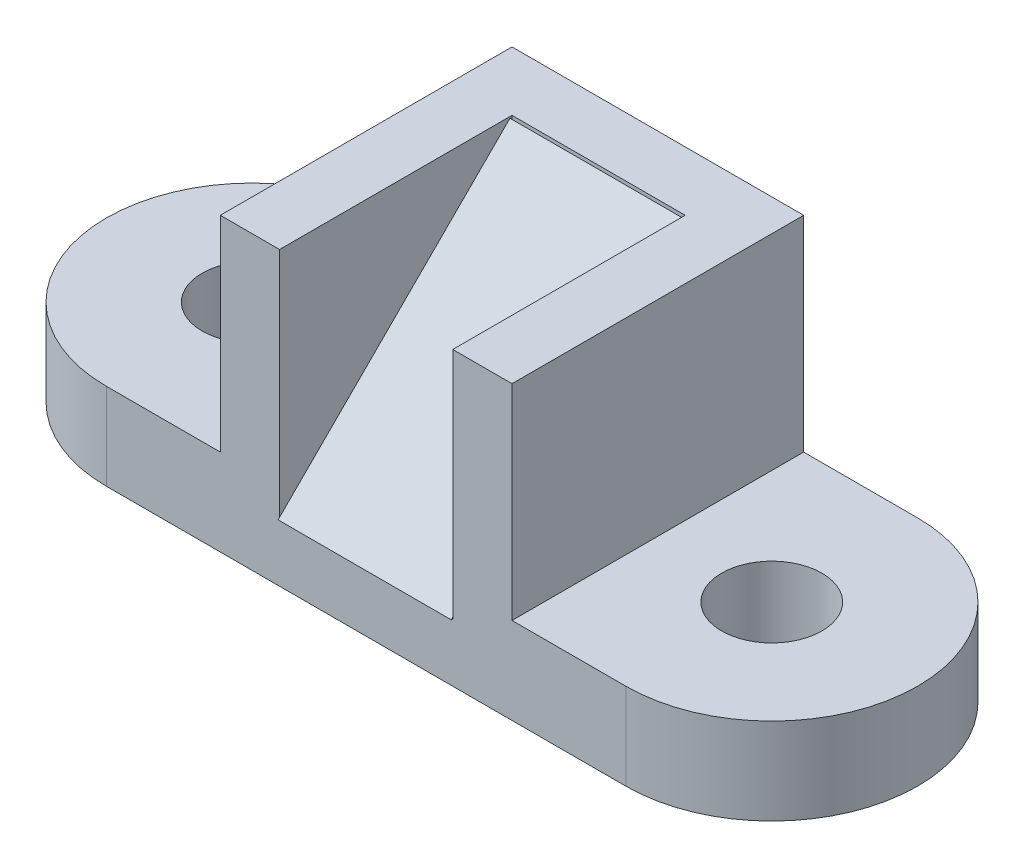
ISO-10303-21;
HEADER;
FILE_DESCRIPTION(('STEP AP214'),'2;1');
FILE_NAME('part.step','',(''),(''),'','','');
FILE_SCHEMA(('AUTOMOTIVE_DESIGN { 1 0 10303 214 1 1 1 1 }'));
ENDSEC;
DATA;
#1=APPLICATION_CONTEXT('core data for automotive mechanical design processes');
#2=APPLICATION_PROTOCOL_DEFINITION('international standard','automotive_design',2000,#1);
#3=PRODUCT_CONTEXT('',#1,'mechanical');
#4=PRODUCT('Part','Part','',(#3));
#5=PRODUCT_RELATED_PRODUCT_CATEGORY('part','',(#4));
#6=PRODUCT_DEFINITION_FORMATION('','',#4);
#7=PRODUCT_DEFINITION_CONTEXT('part definition',#1,'design');
#8=PRODUCT_DEFINITION('design','',#6,#7);
#9=PRODUCT_DEFINITION_SHAPE('','',#8);
#10=(LENGTH_UNIT() NAMED_UNIT(*) SI_UNIT(.MILLI.,.METRE.));
#11=(NAMED_UNIT(*) PLANE_ANGLE_UNIT() SI_UNIT($,.RADIAN.));
#12=(NAMED_UNIT(*) SI_UNIT($,.STERADIAN.) SOLID_ANGLE_UNIT());
#13=UNCERTAINTY_MEASURE_WITH_UNIT(LENGTH_MEASURE(1.E-05),#10,'distance_accuracy_value','');
#14=(GEOMETRIC_REPRESENTATION_CONTEXT(3) GLOBAL_UNCERTAINTY_ASSIGNED_CONTEXT((#13)) GLOBAL_UNIT_ASSIGNED_CONTEXT((#10,
#11,#12)) REPRESENTATION_CONTEXT('',''));
#15=CARTESIAN_POINT('',(0.,0.,0.));
#16=DIRECTION('',(0.,0.,1.));
#17=DIRECTION('',(1.,0.,0.));
#18=AXIS2_PLACEMENT_3D('',#15,#16,#17);
#19=CARTESIAN_POINT('',(0.,19.,32.));
#20=DIRECTION('',(0.,0.,-1.));
#21=DIRECTION('',(-1.,0.,0.));
#22=AXIS2_PLACEMENT_3D('',#19,#20,#21);
#23=PLANE('',#22);
#24=DIRECTION('',(0.,1.,0.));
#25=VECTOR('',#24,1.);
#26=CARTESIAN_POINT('',(76.,64.,32.));
#27=LINE('',#26,#25);
#28=CARTESIAN_POINT('',(76.,12.8068312342512,32.));
#29=VERTEX_POINT('',#28);
#30=CARTESIAN_POINT('',(76.,13.1171786874003,32.));
#31=VERTEX_POINT('',#30);
#32=EDGE_CURVE('E54',#29,#31,#27,.T.);
#33=ORIENTED_EDGE('',*,*,#32,.F.);
#34=DIRECTION('',(1.,0.,0.));
#35=VECTOR('',#34,1.);
#36=CARTESIAN_POINT('',(0.,12.8068312342512,32.));
#37=LINE('',#36,#35);
#38=CARTESIAN_POINT('',(38.,12.8068312342512,32.));
#39=VERTEX_POINT('',#38);
#40=EDGE_CURVE('E58',#39,#29,#37,.T.);
#41=ORIENTED_EDGE('',*,*,#40,.F.);
#42=DIRECTION('',(0.,1.,0.));
#43=VECTOR('',#42,1.);
#44=CARTESIAN_POINT('',(38.,19.,32.));
#45=LINE('',#44,#43);
#46=CARTESIAN_POINT('',(38.,13.1171786874003,32.));
#47=VERTEX_POINT('',#46);
#48=EDGE_CURVE('E196',#39,#47,#45,.T.);
#49=ORIENTED_EDGE('',*,*,#48,.T.);
#50=DIRECTION('',(0.,-1.,0.));
#51=VECTOR('',#50,1.);
#52=CARTESIAN_POINT('',(38.,64.,32.));
#53=LINE('',#52,#51);
#54=CARTESIAN_POINT('',(38.,64.,32.));
#55=VERTEX_POINT('',#54);
#56=EDGE_CURVE('E199',#55,#47,#53,.T.);
#57=ORIENTED_EDGE('',*,*,#56,.F.);
#58=DIRECTION('',(1.,0.,0.));
#59=VECTOR('',#58,1.);
#60=CARTESIAN_POINT('',(25.,64.,32.));
#61=LINE('',#60,#59);
#62=CARTESIAN_POINT('',(25.,64.,32.));
#63=VERTEX_POINT('',#62);
#64=EDGE_CURVE('E235',#63,#55,#61,.T.);
#65=ORIENTED_EDGE('',*,*,#64,.F.);
#66=DIRECTION('',(0.,-1.,0.));
#67=VECTOR('',#66,1.);
#68=CARTESIAN_POINT('',(25.,64.,32.));
#69=LINE('',#68,#67);
#70=CARTESIAN_POINT('',(25.,19.,32.));
#71=VERTEX_POINT('',#70);
#72=EDGE_CURVE('E245',#63,#71,#69,.T.);
#73=ORIENTED_EDGE('',*,*,#72,.T.);
#74=DIRECTION('',(1.,0.,0.));
#75=VECTOR('',#74,1.);
#76=CARTESIAN_POINT('',(0.,19.,32.));
#77=LINE('',#76,#75);
#78=CARTESIAN_POINT('',(0.,19.,32.));
#79=VERTEX_POINT('',#78);
#80=EDGE_CURVE('E272',#79,#71,#77,.T.);
#81=ORIENTED_EDGE('',*,*,#80,.F.);
#82=DIRECTION('',(0.,-1.,0.));
#83=VECTOR('',#82,1.);
#84=CARTESIAN_POINT('',(0.,19.,32.));
#85=LINE('',#84,#83);
#86=CARTESIAN_POINT('',(0.,0.,32.));
#87=VERTEX_POINT('',#86);
#88=EDGE_CURVE('E47',#79,#87,#85,.T.);
#89=ORIENTED_EDGE('',*,*,#88,.T.);
#90=DIRECTION('',(1.,0.,0.));
#91=VECTOR('',#90,1.);
#92=CARTESIAN_POINT('',(0.,0.,32.));
#93=LINE('',#92,#91);
#94=CARTESIAN_POINT('',(114.,0.,32.));
#95=VERTEX_POINT('',#94);
#96=EDGE_CURVE('E282',#87,#95,#93,.T.);
#97=ORIENTED_EDGE('',*,*,#96,.T.);
#98=DIRECTION('',(0.,-1.,0.));
#99=VECTOR('',#98,1.);
#100=CARTESIAN_POINT('',(114.,19.,32.));
#101=LINE('',#100,#99);
#102=CARTESIAN_POINT('',(114.,19.,32.));
#103=VERTEX_POINT('',#102);
#104=EDGE_CURVE('E292',#103,#95,#101,.T.);
#105=ORIENTED_EDGE('',*,*,#104,.F.);
#106=CARTESIAN_POINT('',(89.,19.,32.));
#107=VERTEX_POINT('',#106);
#108=EDGE_CURVE('E270',#107,#103,#77,.T.);
#109=ORIENTED_EDGE('',*,*,#108,.F.);
#110=DIRECTION('',(0.,-1.,0.));
#111=VECTOR('',#110,1.);
#112=CARTESIAN_POINT('',(89.,64.,32.));
#113=LINE('',#112,#111);
#114=CARTESIAN_POINT('',(89.,64.,32.));
#115=VERTEX_POINT('',#114);
#116=EDGE_CURVE('E238',#115,#107,#113,.T.);
#117=ORIENTED_EDGE('',*,*,#116,.F.);
#118=CARTESIAN_POINT('',(76.,64.,32.));
#119=VERTEX_POINT('',#118);
#120=EDGE_CURVE('E234',#119,#115,#61,.T.);
#121=ORIENTED_EDGE('',*,*,#120,.F.);
#122=EDGE_CURVE('E214',#31,#119,#27,.T.);
#123=ORIENTED_EDGE('',*,*,#122,.F.);
#124=EDGE_LOOP('',(#33,#41,#49,#57,#65,#73,#81,#89,#97,#105,#109,#117,#121,#123));
#125=FACE_BOUND('',#124,.T.);
#126=ADVANCED_FACE('F39',(#125),#23,.F.);
#127=CARTESIAN_POINT('',(38.,64.,-19.));
#128=DIRECTION('',(-1.,0.,0.));
#129=DIRECTION('',(0.,-1.,0.));
#130=AXIS2_PLACEMENT_3D('',#127,#128,#129);
#131=PLANE('',#130);
#132=DIRECTION('',(0.,-0.707106781186554,0.707106781186541));
#133=VECTOR('',#132,1.);
#134=CARTESIAN_POINT('',(38.,63.6667157197275,-18.5495370323263));
#135=LINE('',#134,#133);
#136=CARTESIAN_POINT('',(38.,63.6667157197275,-18.5495370323263));
#137=VERTEX_POINT('',#136);
#138=EDGE_CURVE('E189',#137,#47,#135,.T.);
#139=ORIENTED_EDGE('',*,*,#138,.F.);
#140=DIRECTION('',(0.,1.,0.));
#141=VECTOR('',#140,1.);
#142=CARTESIAN_POINT('',(38.,15.7728528599499,-18.5495370323263));
#143=LINE('',#142,#141);
#144=CARTESIAN_POINT('',(38.,15.7728528599499,-18.5495370323263));
#145=VERTEX_POINT('',#144);
#146=EDGE_CURVE('E186',#145,#137,#143,.T.);
#147=ORIENTED_EDGE('',*,*,#146,.F.);
#148=DIRECTION('',(0.,0.0585748002214862,-0.998283022383439));
#149=VECTOR('',#148,1.);
#150=CARTESIAN_POINT('',(38.,12.7874863571513,32.329692330249));
#151=LINE('',#150,#149);
#152=CARTESIAN_POINT('',(38.,13.,28.7078487920973));
#153=VERTEX_POINT('',#152);
#154=EDGE_CURVE('E191',#153,#145,#151,.T.);
#155=ORIENTED_EDGE('',*,*,#154,.F.);
#156=DIRECTION('',(0.,0.,1.));
#157=VECTOR('',#156,1.);
#158=CARTESIAN_POINT('',(38.,13.,-19.));
#159=LINE('',#158,#157);
#160=CARTESIAN_POINT('',(38.,13.,-19.));
#161=VERTEX_POINT('',#160);
#162=EDGE_CURVE('E211',#161,#153,#159,.T.);
#163=ORIENTED_EDGE('',*,*,#162,.F.);
#164=DIRECTION('',(0.,-1.,0.));
#165=VECTOR('',#164,1.);
#166=CARTESIAN_POINT('',(38.,64.,-19.));
#167=LINE('',#166,#165);
#168=CARTESIAN_POINT('',(38.,64.,-19.));
#169=VERTEX_POINT('',#168);
#170=EDGE_CURVE('E200',#169,#161,#167,.T.);
#171=ORIENTED_EDGE('',*,*,#170,.F.);
#172=DIRECTION('',(0.,0.,1.));
#173=VECTOR('',#172,1.);
#174=CARTESIAN_POINT('',(38.,64.,-19.));
#175=LINE('',#174,#173);
#176=EDGE_CURVE('E216',#169,#55,#175,.T.);
#177=ORIENTED_EDGE('',*,*,#176,.T.);
#178=ORIENTED_EDGE('',*,*,#56,.T.);
#179=EDGE_LOOP('',(#139,#147,#155,#163,#171,#177,#178));
#180=FACE_BOUND('',#179,.T.);
#181=ADVANCED_FACE('F339',(#180),#131,.F.);
#182=CARTESIAN_POINT('',(76.,64.,-19.));
#183=DIRECTION('',(1.,0.,0.));
#184=DIRECTION('',(0.,1.,0.));
#185=AXIS2_PLACEMENT_3D('',#182,#183,#184);
#186=PLANE('',#185);
#187=DIRECTION('',(0.,-0.707106781186554,0.707106781186541));
#188=VECTOR('',#187,1.);
#189=CARTESIAN_POINT('',(76.,63.6667157197275,-18.5495370323263));
#190=LINE('',#189,#188);
#191=CARTESIAN_POINT('',(76.,63.6667157197275,-18.5495370323263));
#192=VERTEX_POINT('',#191);
#193=EDGE_CURVE('E164',#192,#31,#190,.T.);
#194=ORIENTED_EDGE('',*,*,#193,.T.);
#195=ORIENTED_EDGE('',*,*,#122,.T.);
#196=DIRECTION('',(0.,0.,1.));
#197=VECTOR('',#196,1.);
#198=CARTESIAN_POINT('',(76.,64.,-19.));
#199=LINE('',#198,#197);
#200=CARTESIAN_POINT('',(76.,64.,-19.));
#201=VERTEX_POINT('',#200);
#202=EDGE_CURVE('E219',#201,#119,#199,.T.);
#203=ORIENTED_EDGE('',*,*,#202,.F.);
#204=DIRECTION('',(0.,1.,0.));
#205=VECTOR('',#204,1.);
#206=CARTESIAN_POINT('',(76.,64.,-19.));
#207=LINE('',#206,#205);
#208=CARTESIAN_POINT('',(76.,13.,-19.));
#209=VERTEX_POINT('',#208);
#210=EDGE_CURVE('E206',#209,#201,#207,.T.);
#211=ORIENTED_EDGE('',*,*,#210,.F.);
#212=DIRECTION('',(0.,0.,1.));
#213=VECTOR('',#212,1.);
#214=CARTESIAN_POINT('',(76.,13.,-19.));
#215=LINE('',#214,#213);
#216=CARTESIAN_POINT('',(76.,13.,28.7078487920973));
#217=VERTEX_POINT('',#216);
#218=EDGE_CURVE('E222',#209,#217,#215,.T.);
#219=ORIENTED_EDGE('',*,*,#218,.T.);
#220=DIRECTION('',(0.,0.0585748002214862,-0.998283022383439));
#221=VECTOR('',#220,1.);
#222=CARTESIAN_POINT('',(76.,12.7874863571513,32.329692330249));
#223=LINE('',#222,#221);
#224=CARTESIAN_POINT('',(76.,15.7728528599499,-18.5495370323263));
#225=VERTEX_POINT('',#224);
#226=EDGE_CURVE('E180',#217,#225,#223,.T.);
#227=ORIENTED_EDGE('',*,*,#226,.T.);
#228=DIRECTION('',(0.,1.,0.));
#229=VECTOR('',#228,1.);
#230=CARTESIAN_POINT('',(76.,15.7728528599499,-18.5495370323263));
#231=LINE('',#230,#229);
#232=EDGE_CURVE('E165',#225,#192,#231,.T.);
#233=ORIENTED_EDGE('',*,*,#232,.T.);
#234=EDGE_LOOP('',(#194,#195,#203,#211,#219,#227,#233));
#235=FACE_BOUND('',#234,.T.);
#236=ADVANCED_FACE('F329',(#235),#186,.F.);
#237=CARTESIAN_POINT('',(38.,13.,-19.));
#238=DIRECTION('',(0.,-1.,0.));
#239=DIRECTION('',(0.,0.,-1.));
#240=AXIS2_PLACEMENT_3D('',#237,#238,#239);
#241=PLANE('',#240);
#242=DIRECTION('',(-1.,0.,0.));
#243=VECTOR('',#242,1.);
#244=CARTESIAN_POINT('',(37.9999999999999,13.,28.7078487920979));
#245=LINE('',#244,#243);
#246=EDGE_CURVE('E11',#217,#153,#245,.T.);
#247=ORIENTED_EDGE('',*,*,#246,.F.);
#248=ORIENTED_EDGE('',*,*,#218,.F.);
#249=DIRECTION('',(1.,0.,0.));
#250=VECTOR('',#249,1.);
#251=CARTESIAN_POINT('',(38.,13.,-19.));
#252=LINE('',#251,#250);
#253=EDGE_CURVE('E203',#161,#209,#252,.T.);
#254=ORIENTED_EDGE('',*,*,#253,.F.);
#255=ORIENTED_EDGE('',*,*,#162,.T.);
#256=EDGE_LOOP('',(#247,#248,#254,#255));
#257=FACE_BOUND('',#256,.T.);
#258=ADVANCED_FACE('F344',(#257),#241,.F.);
#259=CARTESIAN_POINT('',(0.,19.,0.));
#260=DIRECTION('',(0.,1.,0.));
#261=DIRECTION('',(0.,0.,1.));
#262=AXIS2_PLACEMENT_3D('',#259,#260,#261);
#263=PLANE('',#262);
#264=DIRECTION('',(0.,0.,-1.));
#265=VECTOR('',#264,1.);
#266=CARTESIAN_POINT('',(89.,19.,-32.));
#267=LINE('',#266,#265);
#268=CARTESIAN_POINT('',(89.,19.,-32.));
#269=VERTEX_POINT('',#268);
#270=EDGE_CURVE('E218',#107,#269,#267,.T.);
#271=ORIENTED_EDGE('',*,*,#270,.F.);
#272=ORIENTED_EDGE('',*,*,#108,.T.);
#273=CARTESIAN_POINT('',(114.,19.,0.));
#274=DIRECTION('',(0.,1.,0.));
#275=DIRECTION('',(0.,0.,1.));
#276=AXIS2_PLACEMENT_3D('',#273,#274,#275);
#277=CIRCLE('',#276,32.);
#278=CARTESIAN_POINT('',(114.,19.,-32.));
#279=VERTEX_POINT('',#278);
#280=EDGE_CURVE('E274',#103,#279,#277,.T.);
#281=ORIENTED_EDGE('',*,*,#280,.T.);
#282=DIRECTION('',(-1.,0.,0.));
#283=VECTOR('',#282,1.);
#284=CARTESIAN_POINT('',(0.,19.,-32.));
#285=LINE('',#284,#283);
#286=EDGE_CURVE('E277',#279,#269,#285,.T.);
#287=ORIENTED_EDGE('',*,*,#286,.T.);
#288=EDGE_LOOP('',(#271,#272,#281,#287));
#289=FACE_BOUND('',#288,.T.);
#290=CARTESIAN_POINT('',(114.,19.,0.));
#291=DIRECTION('',(0.,1.,0.));
#292=DIRECTION('',(0.,0.,-1.));
#293=AXIS2_PLACEMENT_3D('',#290,#291,#292);
#294=CIRCLE('',#293,11.);
#295=CARTESIAN_POINT('',(114.,19.,-10.9999999999999));
#296=VERTEX_POINT('',#295);
#297=EDGE_CURVE('E262',#296,#296,#294,.T.);
#298=ORIENTED_EDGE('',*,*,#297,.F.);
#299=EDGE_LOOP('',(#298));
#300=FACE_BOUND('',#299,.T.);
#301=ADVANCED_FACE('F314',(#289,#300),#263,.T.);
#302=CARTESIAN_POINT('',(0.,19.,0.));
#303=DIRECTION('',(0.,-1.,0.));
#304=DIRECTION('',(0.,0.,-1.));
#305=AXIS2_PLACEMENT_3D('',#302,#303,#304);
#306=CYLINDRICAL_SURFACE('',#305,32.);
#307=CARTESIAN_POINT('',(0.,0.,0.));
#308=DIRECTION('',(0.,1.,0.));
#309=DIRECTION('',(0.,0.,1.));
#310=AXIS2_PLACEMENT_3D('',#307,#308,#309);
#311=CIRCLE('',#310,32.);
#312=CARTESIAN_POINT('',(0.,0.,-32.));
#313=VERTEX_POINT('',#312);
#314=EDGE_CURVE('E258',#313,#87,#311,.T.);
#315=ORIENTED_EDGE('',*,*,#314,.T.);
#316=ORIENTED_EDGE('',*,*,#88,.F.);
#317=CARTESIAN_POINT('',(0.,19.,0.));
#318=DIRECTION('',(0.,1.,0.));
#319=DIRECTION('',(0.,0.,1.));
#320=AXIS2_PLACEMENT_3D('',#317,#318,#319);
#321=CIRCLE('',#320,32.);
#322=CARTESIAN_POINT('',(0.,19.,-32.));
#323=VERTEX_POINT('',#322);
#324=EDGE_CURVE('E267',#323,#79,#321,.T.);
#325=ORIENTED_EDGE('',*,*,#324,.F.);
#326=DIRECTION('',(0.,-1.,0.));
#327=VECTOR('',#326,1.);
#328=CARTESIAN_POINT('',(0.,19.,-32.));
#329=LINE('',#328,#327);
#330=EDGE_CURVE('E279',#323,#313,#329,.T.);
#331=ORIENTED_EDGE('',*,*,#330,.T.);
#332=EDGE_LOOP('',(#315,#316,#325,#331));
#333=FACE_BOUND('',#332,.T.);
#334=ADVANCED_FACE('F41',(#333),#306,.T.);
#335=CARTESIAN_POINT('',(114.,19.,0.));
#336=DIRECTION('',(0.,-1.,0.));
#337=DIRECTION('',(0.,0.,-1.));
#338=AXIS2_PLACEMENT_3D('',#335,#336,#337);
#339=CYLINDRICAL_SURFACE('',#338,32.);
#340=CARTESIAN_POINT('',(114.,0.,0.));
#341=DIRECTION('',(0.,1.,0.));
#342=DIRECTION('',(0.,0.,1.));
#343=AXIS2_PLACEMENT_3D('',#340,#341,#342);
#344=CIRCLE('',#343,32.);
#345=CARTESIAN_POINT('',(114.,0.,-32.));
#346=VERTEX_POINT('',#345);
#347=EDGE_CURVE('E284',#95,#346,#344,.T.);
#348=ORIENTED_EDGE('',*,*,#347,.T.);
#349=DIRECTION('',(0.,-1.,0.));
#350=VECTOR('',#349,1.);
#351=CARTESIAN_POINT('',(114.,19.,-32.));
#352=LINE('',#351,#350);
#353=EDGE_CURVE('E289',#279,#346,#352,.T.);
#354=ORIENTED_EDGE('',*,*,#353,.F.);
#355=ORIENTED_EDGE('',*,*,#280,.F.);
#356=ORIENTED_EDGE('',*,*,#104,.T.);
#357=EDGE_LOOP('',(#348,#354,#355,#356));
#358=FACE_BOUND('',#357,.T.);
#359=ADVANCED_FACE('F307',(#358),#339,.T.);
#360=CARTESIAN_POINT('',(0.,19.,-32.));
#361=DIRECTION('',(0.,0.,1.));
#362=DIRECTION('',(1.,0.,0.));
#363=AXIS2_PLACEMENT_3D('',#360,#361,#362);
#364=PLANE('',#363);
#365=DIRECTION('',(-1.,0.,0.));
#366=VECTOR('',#365,1.);
#367=CARTESIAN_POINT('',(0.,0.,-32.));
#368=LINE('',#367,#366);
#369=EDGE_CURVE('E271',#346,#313,#368,.T.);
#370=ORIENTED_EDGE('',*,*,#369,.T.);
#371=ORIENTED_EDGE('',*,*,#330,.F.);
#372=CARTESIAN_POINT('',(25.,19.,-32.));
#373=VERTEX_POINT('',#372);
#374=EDGE_CURVE('E276',#373,#323,#285,.T.);
#375=ORIENTED_EDGE('',*,*,#374,.F.);
#376=DIRECTION('',(0.,-1.,0.));
#377=VECTOR('',#376,1.);
#378=CARTESIAN_POINT('',(25.,64.,-32.));
#379=LINE('',#378,#377);
#380=CARTESIAN_POINT('',(25.,64.,-32.));
#381=VERTEX_POINT('',#380);
#382=EDGE_CURVE('E248',#381,#373,#379,.T.);
#383=ORIENTED_EDGE('',*,*,#382,.F.);
#384=DIRECTION('',(-1.,0.,0.));
#385=VECTOR('',#384,1.);
#386=CARTESIAN_POINT('',(25.,64.,-32.));
#387=LINE('',#386,#385);
#388=CARTESIAN_POINT('',(89.,64.,-32.));
#389=VERTEX_POINT('',#388);
#390=EDGE_CURVE('E229',#389,#381,#387,.T.);
#391=ORIENTED_EDGE('',*,*,#390,.F.);
#392=DIRECTION('',(0.,-1.,0.));
#393=VECTOR('',#392,1.);
#394=CARTESIAN_POINT('',(89.,64.,-32.));
#395=LINE('',#394,#393);
#396=EDGE_CURVE('E251',#389,#269,#395,.T.);
#397=ORIENTED_EDGE('',*,*,#396,.T.);
#398=ORIENTED_EDGE('',*,*,#286,.F.);
#399=ORIENTED_EDGE('',*,*,#353,.T.);
#400=EDGE_LOOP('',(#370,#371,#375,#383,#391,#397,#398,#399));
#401=FACE_BOUND('',#400,.T.);
#402=ADVANCED_FACE('F311',(#401),#364,.F.);
#403=DIRECTION('',(0.,0.,1.));
#404=VECTOR('',#403,1.);
#405=CARTESIAN_POINT('',(25.,19.,-32.));
#406=LINE('',#405,#404);
#407=EDGE_CURVE('E230',#373,#71,#406,.T.);
#408=ORIENTED_EDGE('',*,*,#407,.F.);
#409=ORIENTED_EDGE('',*,*,#374,.T.);
#410=ORIENTED_EDGE('',*,*,#324,.T.);
#411=ORIENTED_EDGE('',*,*,#80,.T.);
#412=EDGE_LOOP('',(#408,#409,#410,#411));
#413=FACE_BOUND('',#412,.T.);
#414=CARTESIAN_POINT('',(0.,19.,0.));
#415=DIRECTION('',(0.,1.,0.));
#416=DIRECTION('',(0.,0.,1.));
#417=AXIS2_PLACEMENT_3D('',#414,#415,#416);
#418=CIRCLE('',#417,11.);
#419=CARTESIAN_POINT('',(0.,19.,11.));
#420=VERTEX_POINT('',#419);
#421=EDGE_CURVE('E259',#420,#420,#418,.T.);
#422=ORIENTED_EDGE('',*,*,#421,.F.);
#423=EDGE_LOOP('',(#422));
#424=FACE_BOUND('',#423,.T.);
#425=ADVANCED_FACE('F356',(#413,#424),#263,.T.);
#426=CARTESIAN_POINT('',(0.,0.,0.));
#427=DIRECTION('',(0.,1.,0.));
#428=DIRECTION('',(0.,0.,1.));
#429=AXIS2_PLACEMENT_3D('',#426,#427,#428);
#430=PLANE('',#429);
#431=CARTESIAN_POINT('',(0.,0.,0.));
#432=DIRECTION('',(0.,1.,0.));
#433=DIRECTION('',(0.,0.,1.));
#434=AXIS2_PLACEMENT_3D('',#431,#432,#433);
#435=CIRCLE('',#434,11.);
#436=CARTESIAN_POINT('',(0.,0.,11.));
#437=VERTEX_POINT('',#436);
#438=EDGE_CURVE('E255',#437,#437,#435,.T.);
#439=ORIENTED_EDGE('',*,*,#438,.T.);
#440=EDGE_LOOP('',(#439));
#441=FACE_BOUND('',#440,.T.);
#442=CARTESIAN_POINT('',(114.,0.,0.));
#443=DIRECTION('',(0.,1.,0.));
#444=DIRECTION('',(0.,0.,-1.));
#445=AXIS2_PLACEMENT_3D('',#442,#443,#444);
#446=CIRCLE('',#445,11.);
#447=CARTESIAN_POINT('',(114.,0.,-10.9999999999999));
#448=VERTEX_POINT('',#447);
#449=EDGE_CURVE('E254',#448,#448,#446,.T.);
#450=ORIENTED_EDGE('',*,*,#449,.T.);
#451=EDGE_LOOP('',(#450));
#452=FACE_BOUND('',#451,.T.);
#453=ORIENTED_EDGE('',*,*,#314,.F.);
#454=ORIENTED_EDGE('',*,*,#369,.F.);
#455=ORIENTED_EDGE('',*,*,#347,.F.);
#456=ORIENTED_EDGE('',*,*,#96,.F.);
#457=EDGE_LOOP('',(#453,#454,#455,#456));
#458=FACE_BOUND('',#457,.T.);
#459=ADVANCED_FACE('F303',(#441,#452,#458),#430,.F.);
#460=CARTESIAN_POINT('',(114.,0.,0.));
#461=DIRECTION('',(0.,1.,0.));
#462=DIRECTION('',(0.,0.,1.));
#463=AXIS2_PLACEMENT_3D('',#460,#461,#462);
#464=CYLINDRICAL_SURFACE('',#463,11.);
#465=ORIENTED_EDGE('',*,*,#449,.F.);
#466=EDGE_LOOP('',(#465));
#467=FACE_BOUND('',#466,.T.);
#468=ORIENTED_EDGE('',*,*,#297,.T.);
#469=EDGE_LOOP('',(#468));
#470=FACE_BOUND('',#469,.T.);
#471=ADVANCED_FACE('F364',(#467,#470),#464,.F.);
#472=CARTESIAN_POINT('',(0.,0.,0.));
#473=DIRECTION('',(0.,1.,0.));
#474=DIRECTION('',(0.,0.,1.));
#475=AXIS2_PLACEMENT_3D('',#472,#473,#474);
#476=CYLINDRICAL_SURFACE('',#475,11.);
#477=ORIENTED_EDGE('',*,*,#438,.F.);
#478=EDGE_LOOP('',(#477));
#479=FACE_BOUND('',#478,.T.);
#480=ORIENTED_EDGE('',*,*,#421,.T.);
#481=EDGE_LOOP('',(#480));
#482=FACE_BOUND('',#481,.T.);
#483=ADVANCED_FACE('F362',(#479,#482),#476,.F.);
#484=CARTESIAN_POINT('',(89.,64.,-32.));
#485=DIRECTION('',(-1.,0.,0.));
#486=DIRECTION('',(0.,0.,1.));
#487=AXIS2_PLACEMENT_3D('',#484,#485,#486);
#488=PLANE('',#487);
#489=ORIENTED_EDGE('',*,*,#270,.T.);
#490=ORIENTED_EDGE('',*,*,#396,.F.);
#491=DIRECTION('',(0.,0.,-1.));
#492=VECTOR('',#491,1.);
#493=CARTESIAN_POINT('',(89.,64.,-32.));
#494=LINE('',#493,#492);
#495=EDGE_CURVE('E226',#115,#389,#494,.T.);
#496=ORIENTED_EDGE('',*,*,#495,.F.);
#497=ORIENTED_EDGE('',*,*,#116,.T.);
#498=EDGE_LOOP('',(#489,#490,#496,#497));
#499=FACE_BOUND('',#498,.T.);
#500=ADVANCED_FACE('F321',(#499),#488,.F.);
#501=CARTESIAN_POINT('',(25.,64.,-32.));
#502=DIRECTION('',(1.,0.,0.));
#503=DIRECTION('',(0.,0.,-1.));
#504=AXIS2_PLACEMENT_3D('',#501,#502,#503);
#505=PLANE('',#504);
#506=ORIENTED_EDGE('',*,*,#407,.T.);
#507=ORIENTED_EDGE('',*,*,#72,.F.);
#508=DIRECTION('',(0.,0.,1.));
#509=VECTOR('',#508,1.);
#510=CARTESIAN_POINT('',(25.,64.,-32.));
#511=LINE('',#510,#509);
#512=EDGE_CURVE('E232',#381,#63,#511,.T.);
#513=ORIENTED_EDGE('',*,*,#512,.F.);
#514=ORIENTED_EDGE('',*,*,#382,.T.);
#515=EDGE_LOOP('',(#506,#507,#513,#514));
#516=FACE_BOUND('',#515,.T.);
#517=ADVANCED_FACE('F353',(#516),#505,.F.);
#518=CARTESIAN_POINT('',(0.,64.,0.));
#519=DIRECTION('',(0.,1.,0.));
#520=DIRECTION('',(0.,0.,1.));
#521=AXIS2_PLACEMENT_3D('',#518,#519,#520);
#522=PLANE('',#521);
#523=ORIENTED_EDGE('',*,*,#176,.F.);
#524=DIRECTION('',(-1.,0.,0.));
#525=VECTOR('',#524,1.);
#526=CARTESIAN_POINT('',(38.,64.,-19.));
#527=LINE('',#526,#525);
#528=EDGE_CURVE('E208',#201,#169,#527,.T.);
#529=ORIENTED_EDGE('',*,*,#528,.F.);
#530=ORIENTED_EDGE('',*,*,#202,.T.);
#531=ORIENTED_EDGE('',*,*,#120,.T.);
#532=ORIENTED_EDGE('',*,*,#495,.T.);
#533=ORIENTED_EDGE('',*,*,#390,.T.);
#534=ORIENTED_EDGE('',*,*,#512,.T.);
#535=ORIENTED_EDGE('',*,*,#64,.T.);
#536=EDGE_LOOP('',(#523,#529,#530,#531,#532,#533,#534,#535));
#537=FACE_BOUND('',#536,.T.);
#538=ADVANCED_FACE('F324',(#537),#522,.T.);
#539=CARTESIAN_POINT('',(0.,0.,-19.));
#540=DIRECTION('',(0.,0.,1.));
#541=DIRECTION('',(1.,0.,0.));
#542=AXIS2_PLACEMENT_3D('',#539,#540,#541);
#543=PLANE('',#542);
#544=ORIENTED_EDGE('',*,*,#170,.T.);
#545=ORIENTED_EDGE('',*,*,#253,.T.);
#546=ORIENTED_EDGE('',*,*,#210,.T.);
#547=ORIENTED_EDGE('',*,*,#528,.T.);
#548=EDGE_LOOP('',(#544,#545,#546,#547));
#549=FACE_BOUND('',#548,.T.);
#550=ADVANCED_FACE('F347',(#549),#543,.T.);
#551=CARTESIAN_POINT('',(76.,12.7874863571513,32.329692330249));
#552=DIRECTION('',(0.,0.998283022383439,0.0585748002214862));
#553=DIRECTION('',(0.,-0.0585748002214863,0.998283022383439));
#554=AXIS2_PLACEMENT_3D('',#551,#552,#553);
#555=PLANE('',#554);
#556=CARTESIAN_POINT('',(38.,12.7874863571513,32.329692330249));
#557=VERTEX_POINT('',#556);
#558=EDGE_CURVE('E192',#557,#39,#151,.T.);
#559=ORIENTED_EDGE('',*,*,#558,.T.);
#560=ORIENTED_EDGE('',*,*,#40,.T.);
#561=CARTESIAN_POINT('',(76.,12.7874863571513,32.329692330249));
#562=VERTEX_POINT('',#561);
#563=EDGE_CURVE('E161',#562,#29,#223,.T.);
#564=ORIENTED_EDGE('',*,*,#563,.F.);
#565=DIRECTION('',(-1.,0.,0.));
#566=VECTOR('',#565,1.);
#567=CARTESIAN_POINT('',(76.,12.7874863571513,32.329692330249));
#568=LINE('',#567,#566);
#569=EDGE_CURVE('E168',#562,#557,#568,.T.);
#570=ORIENTED_EDGE('',*,*,#569,.T.);
#571=EDGE_LOOP('',(#559,#560,#564,#570));
#572=FACE_BOUND('',#571,.T.);
#573=ADVANCED_FACE('F179',(#572),#555,.F.);
#574=ORIENTED_EDGE('',*,*,#226,.F.);
#575=ORIENTED_EDGE('',*,*,#246,.T.);
#576=ORIENTED_EDGE('',*,*,#154,.T.);
#577=DIRECTION('',(-1.,0.,0.));
#578=VECTOR('',#577,1.);
#579=CARTESIAN_POINT('',(76.,15.7728528599499,-18.5495370323263));
#580=LINE('',#579,#578);
#581=EDGE_CURVE('E177',#225,#145,#580,.T.);
#582=ORIENTED_EDGE('',*,*,#581,.F.);
#583=EDGE_LOOP('',(#574,#575,#576,#582));
#584=FACE_BOUND('',#583,.T.);
#585=ADVANCED_FACE('F342',(#584),#555,.F.);
#586=CARTESIAN_POINT('',(76.,0.,0.));
#587=DIRECTION('',(-1.,0.,0.));
#588=DIRECTION('',(0.,-1.,0.));
#589=AXIS2_PLACEMENT_3D('',#586,#587,#588);
#590=PLANE('',#589);
#591=ORIENTED_EDGE('',*,*,#563,.T.);
#592=ORIENTED_EDGE('',*,*,#32,.T.);
#593=EDGE_CURVE('E157',#31,#562,#190,.T.);
#594=ORIENTED_EDGE('',*,*,#593,.T.);
#595=EDGE_LOOP('',(#591,#592,#594));
#596=FACE_BOUND('',#595,.T.);
#597=ADVANCED_FACE('F159',(#596),#590,.F.);
#598=CARTESIAN_POINT('',(38.,0.,0.));
#599=DIRECTION('',(-1.,0.,0.));
#600=DIRECTION('',(0.,-1.,0.));
#601=AXIS2_PLACEMENT_3D('',#598,#599,#600);
#602=PLANE('',#601);
#603=ORIENTED_EDGE('',*,*,#48,.F.);
#604=ORIENTED_EDGE('',*,*,#558,.F.);
#605=EDGE_CURVE('E172',#47,#557,#135,.T.);
#606=ORIENTED_EDGE('',*,*,#605,.F.);
#607=EDGE_LOOP('',(#603,#604,#606));
#608=FACE_BOUND('',#607,.T.);
#609=ADVANCED_FACE('F469',(#608),#602,.T.);
#610=CARTESIAN_POINT('',(76.,15.7728528599499,-18.5495370323263));
#611=DIRECTION('',(0.,0.,1.));
#612=DIRECTION('',(1.,0.,0.));
#613=AXIS2_PLACEMENT_3D('',#610,#611,#612);
#614=PLANE('',#613);
#615=ORIENTED_EDGE('',*,*,#146,.T.);
#616=DIRECTION('',(-1.,0.,0.));
#617=VECTOR('',#616,1.);
#618=CARTESIAN_POINT('',(76.,63.6667157197275,-18.5495370323263));
#619=LINE('',#618,#617);
#620=EDGE_CURVE('E176',#192,#137,#619,.T.);
#621=ORIENTED_EDGE('',*,*,#620,.F.);
#622=ORIENTED_EDGE('',*,*,#232,.F.);
#623=ORIENTED_EDGE('',*,*,#581,.T.);
#624=EDGE_LOOP('',(#615,#621,#622,#623));
#625=FACE_BOUND('',#624,.T.);
#626=ADVANCED_FACE('F334',(#625),#614,.F.);
#627=CARTESIAN_POINT('',(76.,63.6667157197275,-18.5495370323263));
#628=DIRECTION('',(0.,-0.707106781186541,-0.707106781186554));
#629=DIRECTION('',(0.,0.707106781186554,-0.707106781186541));
#630=AXIS2_PLACEMENT_3D('',#627,#628,#629);
#631=PLANE('',#630);
#632=ORIENTED_EDGE('',*,*,#138,.T.);
#633=ORIENTED_EDGE('',*,*,#605,.T.);
#634=ORIENTED_EDGE('',*,*,#569,.F.);
#635=ORIENTED_EDGE('',*,*,#593,.F.);
#636=ORIENTED_EDGE('',*,*,#193,.F.);
#637=ORIENTED_EDGE('',*,*,#620,.T.);
#638=EDGE_LOOP('',(#632,#633,#634,#635,#636,#637));
#639=FACE_BOUND('',#638,.T.);
#640=ADVANCED_FACE('F170',(#639),#631,.F.);
#641=CLOSED_SHELL('',(#126,#181,#236,#258,#301,#334,#359,#402,#425,#459,#471,#483,#500,#517,
#538,#550,#573,#585,#597,#609,#626,#640));
#642=MANIFOLD_SOLID_BREP('B2',#641);
#643=ADVANCED_BREP_SHAPE_REPRESENTATION('',(#18,#642),#14);
#644=SHAPE_DEFINITION_REPRESENTATION(#9,#643);
ENDSEC;
END-ISO-10303-21;
